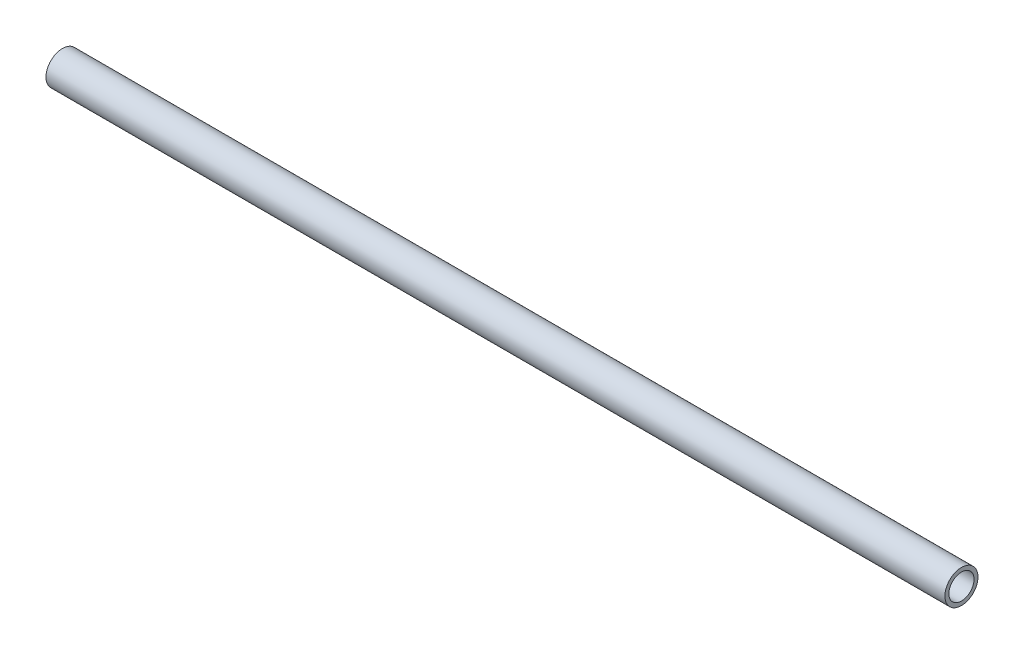
ISO-10303-21;
HEADER;
FILE_DESCRIPTION(('STEP AP214'),'2;1');
FILE_NAME('part.step','',(''),(''),'','','');
FILE_SCHEMA(('AUTOMOTIVE_DESIGN { 1 0 10303 214 1 1 1 1 }'));
ENDSEC;
DATA;
#1=APPLICATION_CONTEXT('core data for automotive mechanical design processes');
#2=APPLICATION_PROTOCOL_DEFINITION('international standard','automotive_design',2000,#1);
#3=PRODUCT_CONTEXT('',#1,'mechanical');
#4=PRODUCT('Part','Part','',(#3));
#5=PRODUCT_RELATED_PRODUCT_CATEGORY('part','',(#4));
#6=PRODUCT_DEFINITION_FORMATION('','',#4);
#7=PRODUCT_DEFINITION_CONTEXT('part definition',#1,'design');
#8=PRODUCT_DEFINITION('design','',#6,#7);
#9=PRODUCT_DEFINITION_SHAPE('','',#8);
#10=(LENGTH_UNIT() NAMED_UNIT(*) SI_UNIT(.MILLI.,.METRE.));
#11=(NAMED_UNIT(*) PLANE_ANGLE_UNIT() SI_UNIT($,.RADIAN.));
#12=(NAMED_UNIT(*) SI_UNIT($,.STERADIAN.) SOLID_ANGLE_UNIT());
#13=UNCERTAINTY_MEASURE_WITH_UNIT(LENGTH_MEASURE(1.E-05),#10,'distance_accuracy_value','');
#14=(GEOMETRIC_REPRESENTATION_CONTEXT(3) GLOBAL_UNCERTAINTY_ASSIGNED_CONTEXT((#13)) GLOBAL_UNIT_ASSIGNED_CONTEXT((#10,
#11,#12)) REPRESENTATION_CONTEXT('',''));
#15=CARTESIAN_POINT('',(0.,0.,0.));
#16=DIRECTION('',(0.,0.,1.));
#17=DIRECTION('',(1.,0.,0.));
#18=AXIS2_PLACEMENT_3D('',#15,#16,#17);
#19=CARTESIAN_POINT('',(690.,0.,0.));
#20=DIRECTION('',(1.,0.,0.));
#21=DIRECTION('',(0.,0.,-1.));
#22=AXIS2_PLACEMENT_3D('',#19,#20,#21);
#23=PLANE('',#22);
#24=CARTESIAN_POINT('',(690.,0.,0.));
#25=DIRECTION('',(1.,0.,0.));
#26=DIRECTION('',(0.,0.,-1.));
#27=AXIS2_PLACEMENT_3D('',#24,#25,#26);
#28=CIRCLE('',#27,12.7);
#29=CARTESIAN_POINT('',(690.,0.,-12.7));
#30=VERTEX_POINT('',#29);
#31=EDGE_CURVE('E10',#30,#30,#28,.T.);
#32=ORIENTED_EDGE('',*,*,#31,.T.);
#33=EDGE_LOOP('',(#32));
#34=FACE_BOUND('',#33,.T.);
#35=CARTESIAN_POINT('',(690.,0.,0.));
#36=DIRECTION('',(1.,0.,0.));
#37=DIRECTION('',(0.,0.,-1.));
#38=AXIS2_PLACEMENT_3D('',#35,#36,#37);
#39=CIRCLE('',#38,9.652);
#40=CARTESIAN_POINT('',(690.,0.,-9.652));
#41=VERTEX_POINT('',#40);
#42=EDGE_CURVE('E45',#41,#41,#39,.T.);
#43=ORIENTED_EDGE('',*,*,#42,.F.);
#44=EDGE_LOOP('',(#43));
#45=FACE_BOUND('',#44,.T.);
#46=ADVANCED_FACE('F34',(#34,#45),#23,.T.);
#47=CARTESIAN_POINT('',(0.,0.,0.));
#48=DIRECTION('',(1.,0.,0.));
#49=DIRECTION('',(0.,0.,-1.));
#50=AXIS2_PLACEMENT_3D('',#47,#48,#49);
#51=PLANE('',#50);
#52=CARTESIAN_POINT('',(0.,0.,0.));
#53=DIRECTION('',(1.,0.,0.));
#54=DIRECTION('',(0.,0.,-1.));
#55=AXIS2_PLACEMENT_3D('',#52,#53,#54);
#56=CIRCLE('',#55,12.7);
#57=CARTESIAN_POINT('',(0.,0.,-12.7));
#58=VERTEX_POINT('',#57);
#59=EDGE_CURVE('E38',#58,#58,#56,.T.);
#60=ORIENTED_EDGE('',*,*,#59,.F.);
#61=EDGE_LOOP('',(#60));
#62=FACE_BOUND('',#61,.T.);
#63=CARTESIAN_POINT('',(0.,0.,0.));
#64=DIRECTION('',(1.,0.,0.));
#65=DIRECTION('',(0.,0.,-1.));
#66=AXIS2_PLACEMENT_3D('',#63,#64,#65);
#67=CIRCLE('',#66,9.652);
#68=CARTESIAN_POINT('',(0.,0.,-9.652));
#69=VERTEX_POINT('',#68);
#70=EDGE_CURVE('E47',#69,#69,#67,.T.);
#71=ORIENTED_EDGE('',*,*,#70,.T.);
#72=EDGE_LOOP('',(#71));
#73=FACE_BOUND('',#72,.T.);
#74=ADVANCED_FACE('F57',(#62,#73),#51,.F.);
#75=CARTESIAN_POINT('',(690.,0.,0.));
#76=DIRECTION('',(-1.,0.,0.));
#77=DIRECTION('',(0.,0.,1.));
#78=AXIS2_PLACEMENT_3D('',#75,#76,#77);
#79=CYLINDRICAL_SURFACE('',#78,12.7);
#80=ORIENTED_EDGE('',*,*,#31,.F.);
#81=EDGE_LOOP('',(#80));
#82=FACE_BOUND('',#81,.T.);
#83=ORIENTED_EDGE('',*,*,#59,.T.);
#84=EDGE_LOOP('',(#83));
#85=FACE_BOUND('',#84,.T.);
#86=ADVANCED_FACE('F36',(#82,#85),#79,.T.);
#87=CARTESIAN_POINT('',(690.,0.,0.));
#88=DIRECTION('',(-1.,0.,0.));
#89=DIRECTION('',(0.,0.,1.));
#90=AXIS2_PLACEMENT_3D('',#87,#88,#89);
#91=CYLINDRICAL_SURFACE('',#90,9.652);
#92=ORIENTED_EDGE('',*,*,#42,.T.);
#93=EDGE_LOOP('',(#92));
#94=FACE_BOUND('',#93,.T.);
#95=ORIENTED_EDGE('',*,*,#70,.F.);
#96=EDGE_LOOP('',(#95));
#97=FACE_BOUND('',#96,.T.);
#98=ADVANCED_FACE('F53',(#94,#97),#91,.F.);
#99=CLOSED_SHELL('',(#46,#74,#86,#98));
#100=MANIFOLD_SOLID_BREP('B2',#99);
#101=ADVANCED_BREP_SHAPE_REPRESENTATION('',(#18,#100),#14);
#102=SHAPE_DEFINITION_REPRESENTATION(#9,#101);
ENDSEC;
END-ISO-10303-21;
